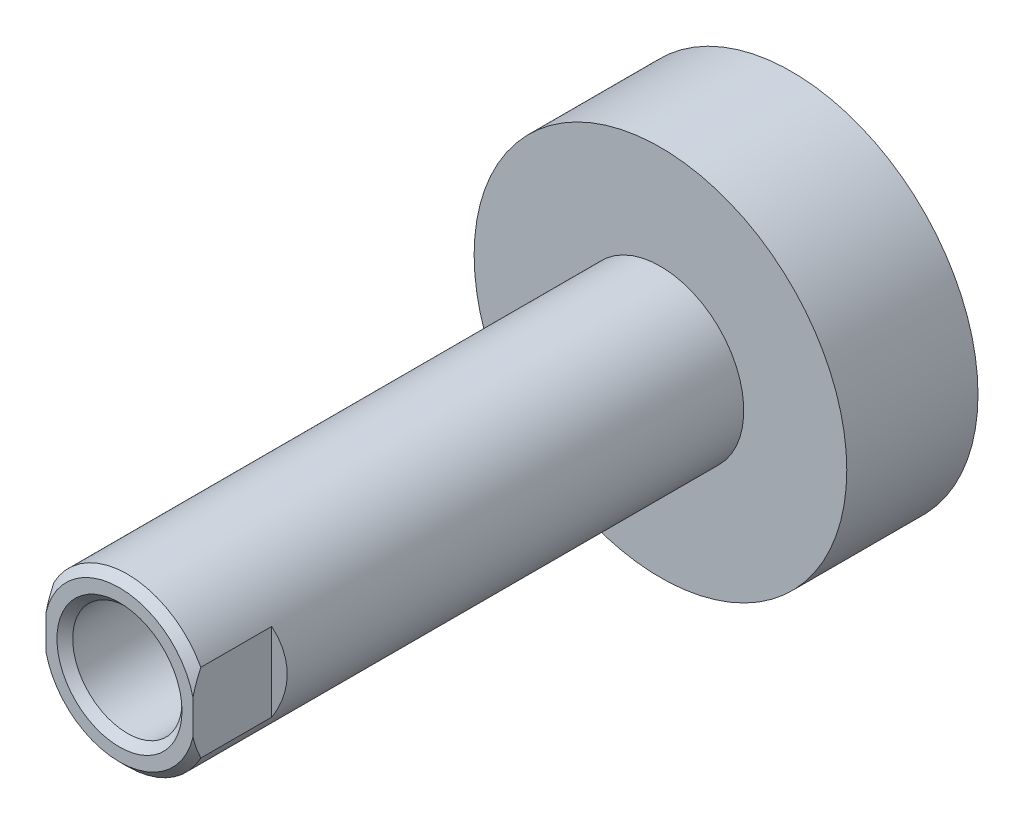
ISO-10303-21;
HEADER;
FILE_DESCRIPTION(('STEP AP214'),'2;1');
FILE_NAME('part.step','',(''),(''),'','','');
FILE_SCHEMA(('AUTOMOTIVE_DESIGN { 1 0 10303 214 1 1 1 1 }'));
ENDSEC;
DATA;
#1=APPLICATION_CONTEXT('core data for automotive mechanical design processes');
#2=APPLICATION_PROTOCOL_DEFINITION('international standard','automotive_design',2000,#1);
#3=PRODUCT_CONTEXT('',#1,'mechanical');
#4=PRODUCT('Part','Part','',(#3));
#5=PRODUCT_RELATED_PRODUCT_CATEGORY('part','',(#4));
#6=PRODUCT_DEFINITION_FORMATION('','',#4);
#7=PRODUCT_DEFINITION_CONTEXT('part definition',#1,'design');
#8=PRODUCT_DEFINITION('design','',#6,#7);
#9=PRODUCT_DEFINITION_SHAPE('','',#8);
#10=(LENGTH_UNIT() NAMED_UNIT(*) SI_UNIT(.MILLI.,.METRE.));
#11=(NAMED_UNIT(*) PLANE_ANGLE_UNIT() SI_UNIT($,.RADIAN.));
#12=(NAMED_UNIT(*) SI_UNIT($,.STERADIAN.) SOLID_ANGLE_UNIT());
#13=UNCERTAINTY_MEASURE_WITH_UNIT(LENGTH_MEASURE(1.E-05),#10,'distance_accuracy_value','');
#14=(GEOMETRIC_REPRESENTATION_CONTEXT(3) GLOBAL_UNCERTAINTY_ASSIGNED_CONTEXT((#13)) GLOBAL_UNIT_ASSIGNED_CONTEXT((#10,
#11,#12)) REPRESENTATION_CONTEXT('',''));
#15=CARTESIAN_POINT('',(0.,0.,0.));
#16=DIRECTION('',(0.,0.,1.));
#17=DIRECTION('',(1.,0.,0.));
#18=AXIS2_PLACEMENT_3D('',#15,#16,#17);
#19=CARTESIAN_POINT('',(0.,0.,11.5365600000246));
#20=DIRECTION('',(0.,0.,1.));
#21=DIRECTION('',(1.,0.,0.));
#22=AXIS2_PLACEMENT_3D('',#19,#20,#21);
#23=CONICAL_SURFACE('',#22,1.72719999989113,1.02974425858718);
#24=CARTESIAN_POINT('',(0.,2.84226460079169E-11,10.4987535388261));
#25=VERTEX_POINT('',#24);
#26=VERTEX_LOOP('',#25);
#27=FACE_BOUND('',#26,.T.);
#28=CARTESIAN_POINT('',(0.,0.,11.53656));
#29=DIRECTION('',(0.,0.,1.));
#30=DIRECTION('',(0.,-1.,0.));
#31=AXIS2_PLACEMENT_3D('',#28,#29,#30);
#32=CIRCLE('',#31,1.7272);
#33=CARTESIAN_POINT('',(0.,-1.7272,11.53656));
#34=VERTEX_POINT('',#33);
#35=EDGE_CURVE('E121',#34,#34,#32,.T.);
#36=ORIENTED_EDGE('',*,*,#35,.T.);
#37=EDGE_LOOP('',(#36));
#38=FACE_BOUND('',#37,.T.);
#39=ADVANCED_FACE('F17',(#27,#38),#23,.F.);
#40=CARTESIAN_POINT('',(0.,0.,25.614));
#41=DIRECTION('',(0.,0.,1.));
#42=DIRECTION('',(0.,-1.,0.));
#43=AXIS2_PLACEMENT_3D('',#40,#41,#42);
#44=CYLINDRICAL_SURFACE('',#43,1.7272);
#45=ORIENTED_EDGE('',*,*,#35,.F.);
#46=EDGE_LOOP('',(#45));
#47=FACE_BOUND('',#46,.T.);
#48=CARTESIAN_POINT('',(0.,0.,13.93));
#49=DIRECTION('',(0.,0.,1.));
#50=DIRECTION('',(0.,-1.,0.));
#51=AXIS2_PLACEMENT_3D('',#48,#49,#50);
#52=CIRCLE('',#51,1.7272);
#53=CARTESIAN_POINT('',(0.,-1.7272,13.93));
#54=VERTEX_POINT('',#53);
#55=EDGE_CURVE('E20',#54,#54,#52,.T.);
#56=ORIENTED_EDGE('',*,*,#55,.T.);
#57=EDGE_LOOP('',(#56));
#58=FACE_BOUND('',#57,.T.);
#59=ADVANCED_FACE('F189',(#47,#58),#44,.F.);
#60=CARTESIAN_POINT('',(1.7272,0.,13.93));
#61=DIRECTION('',(0.,0.,-1.));
#62=DIRECTION('',(0.,1.,0.));
#63=AXIS2_PLACEMENT_3D('',#60,#61,#62);
#64=PLANE('',#63);
#65=CARTESIAN_POINT('',(0.,0.,13.93));
#66=DIRECTION('',(0.,0.,1.));
#67=DIRECTION('',(0.,-1.,0.));
#68=AXIS2_PLACEMENT_3D('',#65,#66,#67);
#69=CIRCLE('',#68,2.0828);
#70=CARTESIAN_POINT('',(0.,-2.0828,13.93));
#71=VERTEX_POINT('',#70);
#72=EDGE_CURVE('E120',#71,#71,#69,.T.);
#73=ORIENTED_EDGE('',*,*,#72,.T.);
#74=EDGE_LOOP('',(#73));
#75=FACE_BOUND('',#74,.T.);
#76=ORIENTED_EDGE('',*,*,#55,.F.);
#77=EDGE_LOOP('',(#76));
#78=FACE_BOUND('',#77,.T.);
#79=ADVANCED_FACE('F186',(#75,#78),#64,.F.);
#80=CARTESIAN_POINT('',(0.,0.,25.614));
#81=DIRECTION('',(0.,0.,1.));
#82=DIRECTION('',(0.,-1.,0.));
#83=AXIS2_PLACEMENT_3D('',#80,#81,#82);
#84=CYLINDRICAL_SURFACE('',#83,2.0828);
#85=CARTESIAN_POINT('',(0.,0.,25.3140000000371));
#86=DIRECTION('',(0.,0.,1.));
#87=DIRECTION('',(0.,-1.,0.));
#88=AXIS2_PLACEMENT_3D('',#85,#86,#87);
#89=CIRCLE('',#88,2.0827999999824);
#90=CARTESIAN_POINT('',(0.,-2.0827999999824,25.3140000000371));
#91=VERTEX_POINT('',#90);
#92=EDGE_CURVE('E117',#91,#91,#89,.T.);
#93=ORIENTED_EDGE('',*,*,#92,.T.);
#94=EDGE_LOOP('',(#93));
#95=FACE_BOUND('',#94,.T.);
#96=ORIENTED_EDGE('',*,*,#72,.F.);
#97=EDGE_LOOP('',(#96));
#98=FACE_BOUND('',#97,.T.);
#99=ADVANCED_FACE('F182',(#95,#98),#84,.F.);
#100=CARTESIAN_POINT('',(0.,0.,0.));
#101=DIRECTION('',(0.,0.,1.));
#102=DIRECTION('',(1.,0.,0.));
#103=AXIS2_PLACEMENT_3D('',#100,#101,#102);
#104=PLANE('',#103);
#105=CARTESIAN_POINT('',(0.,0.,0.));
#106=DIRECTION('',(0.,0.,-1.));
#107=DIRECTION('',(-1.,0.,0.));
#108=AXIS2_PLACEMENT_3D('',#105,#106,#107);
#109=CIRCLE('',#108,7.1);
#110=CARTESIAN_POINT('',(-7.1,0.,0.));
#111=VERTEX_POINT('',#110);
#112=EDGE_CURVE('E82',#111,#111,#109,.F.);
#113=ORIENTED_EDGE('',*,*,#112,.F.);
#114=EDGE_LOOP('',(#113));
#115=FACE_BOUND('',#114,.T.);
#116=ADVANCED_FACE('F178',(#115),#104,.F.);
#117=CARTESIAN_POINT('',(0.,0.,25.6140000000755));
#118=DIRECTION('',(0.,0.,1.));
#119=DIRECTION('',(1.,0.,0.));
#120=AXIS2_PLACEMENT_3D('',#117,#118,#119);
#121=CONICAL_SURFACE('',#120,2.38280000007763,0.785398163492187);
#122=CARTESIAN_POINT('',(0.,0.,25.6139999999618));
#123=DIRECTION('',(0.,0.,1.));
#124=DIRECTION('',(1.,0.,0.));
#125=AXIS2_PLACEMENT_3D('',#122,#123,#124);
#126=CIRCLE('',#125,2.38279999996394);
#127=CARTESIAN_POINT('',(2.38279999996394,0.,25.6139999999618));
#128=VERTEX_POINT('',#127);
#129=EDGE_CURVE('E152',#128,#128,#126,.T.);
#130=ORIENTED_EDGE('',*,*,#129,.T.);
#131=EDGE_LOOP('',(#130));
#132=FACE_BOUND('',#131,.T.);
#133=ORIENTED_EDGE('',*,*,#92,.F.);
#134=EDGE_LOOP('',(#133));
#135=FACE_BOUND('',#134,.T.);
#136=ADVANCED_FACE('F174',(#132,#135),#121,.F.);
#137=CARTESIAN_POINT('',(0.,0.,5.));
#138=DIRECTION('',(0.,0.,-1.));
#139=DIRECTION('',(-1.,0.,0.));
#140=AXIS2_PLACEMENT_3D('',#137,#138,#139);
#141=CYLINDRICAL_SURFACE('',#140,7.1);
#142=ORIENTED_EDGE('',*,*,#112,.T.);
#143=EDGE_LOOP('',(#142));
#144=FACE_BOUND('',#143,.T.);
#145=CARTESIAN_POINT('',(0.,0.,5.));
#146=DIRECTION('',(0.,0.,-1.));
#147=DIRECTION('',(-1.,0.,0.));
#148=AXIS2_PLACEMENT_3D('',#145,#146,#147);
#149=CIRCLE('',#148,7.1);
#150=CARTESIAN_POINT('',(-7.1,0.,5.));
#151=VERTEX_POINT('',#150);
#152=EDGE_CURVE('E149',#151,#151,#149,.F.);
#153=ORIENTED_EDGE('',*,*,#152,.F.);
#154=EDGE_LOOP('',(#153));
#155=FACE_BOUND('',#154,.T.);
#156=ADVANCED_FACE('F169',(#144,#155),#141,.T.);
#157=CARTESIAN_POINT('',(0.,0.,25.3139999999235));
#158=DIRECTION('',(0.,0.,-1.));
#159=DIRECTION('',(0.,1.,0.));
#160=AXIS2_PLACEMENT_3D('',#157,#158,#159);
#161=CONICAL_SURFACE('',#160,3.17499999999882,0.785398163302709);
#162=CARTESIAN_POINT('',(-2.79999999999672,-0.652399417525146,25.6139999999799));
#163=CARTESIAN_POINT('',(-2.79999999999882,-0.725522758866391,25.5974129545509));
#164=CARTESIAN_POINT('',(-2.79999999999968,-0.798035787011699,25.5783055413972));
#165=CARTESIAN_POINT('',(-2.80000000000032,-0.941542467122832,25.535725461008));
#166=CARTESIAN_POINT('',(-2.80000000000009,-1.0125399628547,25.5122658074199));
#167=CARTESIAN_POINT('',(-2.79999999999991,-1.15311390257721,25.4615642521423));
#168=CARTESIAN_POINT('',(-2.79999999999996,-1.22269102456504,25.4343242058067));
#169=CARTESIAN_POINT('',(-2.80000000000005,-1.36069395769507,25.3765145329336));
#170=CARTESIAN_POINT('',(-2.80000000000009,-1.42911576562111,25.3459353184433));
#171=CARTESIAN_POINT('',(-2.8,-1.49687173796956,25.313999999933));
#172=B_SPLINE_CURVE_WITH_KNOTS('',3,(#162,#163,#164,#165,#166,#167,#168,#169,#170,#171),
.UNSPECIFIED.,.F.,.F.,(4,2,2,2,4),(0.,0.224844580121859,0.449027381863307,0.673100544963369,
0.897834918181198),.UNSPECIFIED.);
#173=CARTESIAN_POINT('',(-2.8,-0.652399417443052,25.614));
#174=VERTEX_POINT('',#173);
#175=CARTESIAN_POINT('',(-2.8,-1.49687173798092,25.3139999999665));
#176=VERTEX_POINT('',#175);
#177=EDGE_CURVE('E81',#174,#176,#172,.T.);
#178=ORIENTED_EDGE('',*,*,#177,.T.);
#179=CARTESIAN_POINT('',(0.,0.,25.314));
#180=DIRECTION('',(0.,0.,-1.));
#181=DIRECTION('',(-1.,0.,0.));
#182=AXIS2_PLACEMENT_3D('',#179,#180,#181);
#183=CIRCLE('',#182,3.175);
#184=CARTESIAN_POINT('',(2.8,-1.49687173798091,25.3139999999665));
#185=VERTEX_POINT('',#184);
#186=EDGE_CURVE('E85',#185,#176,#183,.T.);
#187=ORIENTED_EDGE('',*,*,#186,.F.);
#188=CARTESIAN_POINT('',(2.8,-1.49687173796955,25.313999999933));
#189=CARTESIAN_POINT('',(2.8,-1.42911576562111,25.3459353184433));
#190=CARTESIAN_POINT('',(2.8,-1.36069395769508,25.3765145329335));
#191=CARTESIAN_POINT('',(2.8,-1.22269102456509,25.4343242058067));
#192=CARTESIAN_POINT('',(2.8,-1.15311390257727,25.4615642521423));
#193=CARTESIAN_POINT('',(2.8,-1.01253996285478,25.5122658074199));
#194=CARTESIAN_POINT('',(2.8,-0.941542467122903,25.5357254610079));
#195=CARTESIAN_POINT('',(2.8,-0.798035787011902,25.5783055413972));
#196=CARTESIAN_POINT('',(2.8,-0.725522758866727,25.5974129545514));
#197=CARTESIAN_POINT('',(2.8,-0.652399417525751,25.6139999999812));
#198=B_SPLINE_CURVE_WITH_KNOTS('',3,(#188,#189,#190,#191,#192,#193,#194,#195,#196,#197),
.UNSPECIFIED.,.F.,.F.,(4,2,2,2,4),(0.,0.224734373217776,0.448807536317823,0.672990338059194,
0.897834918180934),.UNSPECIFIED.);
#199=CARTESIAN_POINT('',(2.8,-0.652399417443043,25.614));
#200=VERTEX_POINT('',#199);
#201=EDGE_CURVE('E71',#185,#200,#198,.T.);
#202=ORIENTED_EDGE('',*,*,#201,.T.);
#203=CARTESIAN_POINT('',(0.,0.,25.6140000000187));
#204=DIRECTION('',(0.,0.,-1.));
#205=DIRECTION('',(0.,1.,0.));
#206=AXIS2_PLACEMENT_3D('',#203,#204,#205);
#207=CIRCLE('',#206,2.87499999996044);
#208=EDGE_CURVE('E116',#200,#174,#207,.T.);
#209=ORIENTED_EDGE('',*,*,#208,.T.);
#210=EDGE_LOOP('',(#178,#187,#202,#209));
#211=FACE_BOUND('',#210,.T.);
#212=ADVANCED_FACE('F86',(#211),#161,.T.);
#213=CARTESIAN_POINT('',(-2.8,-7.1,22.614));
#214=DIRECTION('',(0.500000000000004,0.,-0.866025403784436));
#215=DIRECTION('',(-0.866025403784436,0.,-0.500000000000004));
#216=AXIS2_PLACEMENT_3D('',#213,#214,#215);
#217=PLANE('',#216);
#218=CARTESIAN_POINT('',(0.,0.,24.230580753731));
#219=DIRECTION('',(0.500000000000004,0.,-0.866025403784436));
#220=DIRECTION('',(-0.866025403784436,0.,-0.500000000000004));
#221=AXIS2_PLACEMENT_3D('',#218,#219,#220);
#222=ELLIPSE('',#221,3.66617420935413,3.175);
#223=CARTESIAN_POINT('',(-2.8,-1.49687173799227,22.614));
#224=VERTEX_POINT('',#223);
#225=CARTESIAN_POINT('',(-2.8,1.49687173799227,22.614));
#226=VERTEX_POINT('',#225);
#227=EDGE_CURVE('E90',#224,#226,#222,.T.);
#228=ORIENTED_EDGE('',*,*,#227,.F.);
#229=DIRECTION('',(0.,1.,0.));
#230=VECTOR('',#229,1.);
#231=CARTESIAN_POINT('',(-2.8,-7.1,22.614));
#232=LINE('',#231,#230);
#233=EDGE_CURVE('E112',#224,#226,#232,.T.);
#234=ORIENTED_EDGE('',*,*,#233,.T.);
#235=EDGE_LOOP('',(#228,#234));
#236=FACE_BOUND('',#235,.T.);
#237=ADVANCED_FACE('F168',(#236),#217,.F.);
#238=CARTESIAN_POINT('',(0.,0.,25.614));
#239=DIRECTION('',(0.,0.,-1.));
#240=DIRECTION('',(0.,1.,0.));
#241=AXIS2_PLACEMENT_3D('',#238,#239,#240);
#242=PLANE('',#241);
#243=ORIENTED_EDGE('',*,*,#129,.F.);
#244=EDGE_LOOP('',(#243));
#245=FACE_BOUND('',#244,.T.);
#246=DIRECTION('',(0.,1.,0.));
#247=VECTOR('',#246,1.);
#248=CARTESIAN_POINT('',(2.8,0.,25.614));
#249=LINE('',#248,#247);
#250=CARTESIAN_POINT('',(2.8,0.652399417401792,25.6140000000093));
#251=VERTEX_POINT('',#250);
#252=EDGE_CURVE('E77',#251,#200,#249,.F.);
#253=ORIENTED_EDGE('',*,*,#252,.F.);
#254=CARTESIAN_POINT('',(0.,0.,25.6140000000187));
#255=DIRECTION('',(0.,0.,-1.));
#256=DIRECTION('',(0.,1.,0.));
#257=AXIS2_PLACEMENT_3D('',#254,#255,#256);
#258=CIRCLE('',#257,2.87499999996044);
#259=CARTESIAN_POINT('',(-2.8,0.652399417401802,25.6140000000093));
#260=VERTEX_POINT('',#259);
#261=EDGE_CURVE('E100',#260,#251,#258,.T.);
#262=ORIENTED_EDGE('',*,*,#261,.F.);
#263=DIRECTION('',(0.,1.,0.));
#264=VECTOR('',#263,1.);
#265=CARTESIAN_POINT('',(-2.8,-7.1,25.614));
#266=LINE('',#265,#264);
#267=EDGE_CURVE('E109',#260,#174,#266,.F.);
#268=ORIENTED_EDGE('',*,*,#267,.T.);
#269=ORIENTED_EDGE('',*,*,#208,.F.);
#270=EDGE_LOOP('',(#253,#262,#268,#269));
#271=FACE_BOUND('',#270,.T.);
#272=ADVANCED_FACE('F216',(#245,#271),#242,.F.);
#273=CARTESIAN_POINT('',(2.8,-7.1,22.614));
#274=DIRECTION('',(-0.500000000000004,0.,-0.866025403784436));
#275=DIRECTION('',(-0.866025403784436,0.,0.500000000000004));
#276=AXIS2_PLACEMENT_3D('',#273,#274,#275);
#277=PLANE('',#276);
#278=CARTESIAN_POINT('',(0.,0.,24.230580753731));
#279=DIRECTION('',(-0.500000000000004,0.,-0.866025403784436));
#280=DIRECTION('',(0.866025403784436,0.,-0.500000000000004));
#281=AXIS2_PLACEMENT_3D('',#278,#279,#280);
#282=ELLIPSE('',#281,3.66617420935413,3.175);
#283=CARTESIAN_POINT('',(2.8,1.49687173799227,22.614));
#284=VERTEX_POINT('',#283);
#285=CARTESIAN_POINT('',(2.8,-1.49687173799227,22.614));
#286=VERTEX_POINT('',#285);
#287=EDGE_CURVE('E91',#284,#286,#282,.T.);
#288=ORIENTED_EDGE('',*,*,#287,.F.);
#289=DIRECTION('',(0.,1.,0.));
#290=VECTOR('',#289,1.);
#291=CARTESIAN_POINT('',(2.8,-7.1,22.614));
#292=LINE('',#291,#290);
#293=EDGE_CURVE('E96',#284,#286,#292,.F.);
#294=ORIENTED_EDGE('',*,*,#293,.T.);
#295=EDGE_LOOP('',(#288,#294));
#296=FACE_BOUND('',#295,.T.);
#297=ADVANCED_FACE('F209',(#296),#277,.F.);
#298=CARTESIAN_POINT('',(0.,0.,5.));
#299=DIRECTION('',(0.,0.,1.));
#300=DIRECTION('',(1.,0.,0.));
#301=AXIS2_PLACEMENT_3D('',#298,#299,#300);
#302=PLANE('',#301);
#303=ORIENTED_EDGE('',*,*,#152,.T.);
#304=EDGE_LOOP('',(#303));
#305=FACE_BOUND('',#304,.T.);
#306=CARTESIAN_POINT('',(0.,0.,5.));
#307=DIRECTION('',(0.,0.,-1.));
#308=DIRECTION('',(-1.,0.,0.));
#309=AXIS2_PLACEMENT_3D('',#306,#307,#308);
#310=CIRCLE('',#309,3.175);
#311=CARTESIAN_POINT('',(-3.175,0.,5.));
#312=VERTEX_POINT('',#311);
#313=EDGE_CURVE('E98',#312,#312,#310,.F.);
#314=ORIENTED_EDGE('',*,*,#313,.F.);
#315=EDGE_LOOP('',(#314));
#316=FACE_BOUND('',#315,.T.);
#317=ADVANCED_FACE('F207',(#305,#316),#302,.T.);
#318=CARTESIAN_POINT('',(-2.8,-7.1,25.614));
#319=DIRECTION('',(1.,0.,0.));
#320=DIRECTION('',(0.,0.,-1.));
#321=AXIS2_PLACEMENT_3D('',#318,#319,#320);
#322=PLANE('',#321);
#323=ORIENTED_EDGE('',*,*,#177,.F.);
#324=ORIENTED_EDGE('',*,*,#267,.F.);
#325=CARTESIAN_POINT('',(-2.8,1.49687173796956,25.313999999933));
#326=CARTESIAN_POINT('',(-2.8,1.42911576562112,25.3459353184433));
#327=CARTESIAN_POINT('',(-2.8,1.36069395769509,25.3765145329335));
#328=CARTESIAN_POINT('',(-2.8,1.22269102456509,25.4343242058067));
#329=CARTESIAN_POINT('',(-2.8,1.15311390257727,25.4615642521423));
#330=CARTESIAN_POINT('',(-2.8,1.01253996285478,25.5122658074199));
#331=CARTESIAN_POINT('',(-2.8,0.94154246712291,25.5357254610079));
#332=CARTESIAN_POINT('',(-2.8,0.79803578701191,25.5783055413972));
#333=CARTESIAN_POINT('',(-2.8,0.725522758866736,25.5974129545514));
#334=CARTESIAN_POINT('',(-2.8,0.65239941752576,25.6139999999812));
#335=B_SPLINE_CURVE_WITH_KNOTS('',3,(#325,#326,#327,#328,#329,#330,#331,#332,#333,#334),
.UNSPECIFIED.,.F.,.F.,(4,2,2,2,4),(0.,0.224734373217775,0.448807536317821,0.672990338059194,
0.897834918180932),.UNSPECIFIED.);
#336=CARTESIAN_POINT('',(-2.8,1.49687173798091,25.3139999999665));
#337=VERTEX_POINT('',#336);
#338=EDGE_CURVE('E108',#337,#260,#335,.T.);
#339=ORIENTED_EDGE('',*,*,#338,.F.);
#340=DIRECTION('',(0.,0.,-1.));
#341=VECTOR('',#340,1.);
#342=CARTESIAN_POINT('',(-2.8,1.49687173799227,34.5942561210692));
#343=LINE('',#342,#341);
#344=EDGE_CURVE('E104',#226,#337,#343,.F.);
#345=ORIENTED_EDGE('',*,*,#344,.F.);
#346=ORIENTED_EDGE('',*,*,#233,.F.);
#347=DIRECTION('',(0.,0.,-1.));
#348=VECTOR('',#347,1.);
#349=CARTESIAN_POINT('',(-2.8,-1.49687173799227,25.614));
#350=LINE('',#349,#348);
#351=EDGE_CURVE('E106',#176,#224,#350,.T.);
#352=ORIENTED_EDGE('',*,*,#351,.F.);
#353=EDGE_LOOP('',(#323,#324,#339,#345,#346,#352));
#354=FACE_BOUND('',#353,.T.);
#355=ADVANCED_FACE('F138',(#354),#322,.F.);
#356=CARTESIAN_POINT('',(0.,0.,25.3139999999235));
#357=DIRECTION('',(0.,0.,-1.));
#358=DIRECTION('',(0.,1.,0.));
#359=AXIS2_PLACEMENT_3D('',#356,#357,#358);
#360=CONICAL_SURFACE('',#359,3.17499999999882,0.785398163302709);
#361=ORIENTED_EDGE('',*,*,#338,.T.);
#362=ORIENTED_EDGE('',*,*,#261,.T.);
#363=CARTESIAN_POINT('',(2.79999999999956,0.652399417527919,25.6139999999805));
#364=CARTESIAN_POINT('',(2.79999999999984,0.725522758868216,25.5974129545509));
#365=CARTESIAN_POINT('',(2.79999999999996,0.798035787012704,25.578305541397));
#366=CARTESIAN_POINT('',(2.80000000000005,0.941542467122344,25.535725461008));
#367=CARTESIAN_POINT('',(2.80000000000002,1.01253996285354,25.5122658074203));
#368=CARTESIAN_POINT('',(2.79999999999999,1.15311390257472,25.4615642521433));
#369=CARTESIAN_POINT('',(2.8,1.22269102456189,25.434324205808));
#370=CARTESIAN_POINT('',(2.80000000000001,1.36069395769062,25.3765145329355));
#371=CARTESIAN_POINT('',(2.80000000000002,1.42911576561603,25.3459353184456));
#372=CARTESIAN_POINT('',(2.8,1.49687173796386,25.3139999999357));
#373=B_SPLINE_CURVE_WITH_KNOTS('',3,(#363,#364,#365,#366,#367,#368,#369,#370,#371,#372),
.UNSPECIFIED.,.F.,.F.,(4,2,2,2,4),(0.,0.224844580119593,0.449027381858833,0.673100544956742,
0.897834918172369),.UNSPECIFIED.);
#374=CARTESIAN_POINT('',(2.8,1.49687173797728,25.3139999999682));
#375=VERTEX_POINT('',#374);
#376=EDGE_CURVE('E35',#251,#375,#373,.T.);
#377=ORIENTED_EDGE('',*,*,#376,.T.);
#378=CARTESIAN_POINT('',(0.,0.,25.314));
#379=DIRECTION('',(0.,0.,-1.));
#380=DIRECTION('',(-1.,0.,0.));
#381=AXIS2_PLACEMENT_3D('',#378,#379,#380);
#382=CIRCLE('',#381,3.175);
#383=EDGE_CURVE('E26',#337,#375,#382,.T.);
#384=ORIENTED_EDGE('',*,*,#383,.F.);
#385=EDGE_LOOP('',(#361,#362,#377,#384));
#386=FACE_BOUND('',#385,.T.);
#387=ADVANCED_FACE('F134',(#386),#360,.T.);
#388=CARTESIAN_POINT('',(2.8,-7.1,25.614));
#389=DIRECTION('',(-1.,0.,0.));
#390=DIRECTION('',(0.,0.,1.));
#391=AXIS2_PLACEMENT_3D('',#388,#389,#390);
#392=PLANE('',#391);
#393=ORIENTED_EDGE('',*,*,#376,.F.);
#394=ORIENTED_EDGE('',*,*,#252,.T.);
#395=ORIENTED_EDGE('',*,*,#201,.F.);
#396=DIRECTION('',(0.,0.,1.));
#397=VECTOR('',#396,1.);
#398=CARTESIAN_POINT('',(2.8,-1.49687173799226,25.614));
#399=LINE('',#398,#397);
#400=EDGE_CURVE('E76',#286,#185,#399,.T.);
#401=ORIENTED_EDGE('',*,*,#400,.F.);
#402=ORIENTED_EDGE('',*,*,#293,.F.);
#403=DIRECTION('',(0.,0.,-1.));
#404=VECTOR('',#403,1.);
#405=CARTESIAN_POINT('',(2.8,1.49687173799227,34.5942561210692));
#406=LINE('',#405,#404);
#407=EDGE_CURVE('E11',#375,#284,#406,.T.);
#408=ORIENTED_EDGE('',*,*,#407,.F.);
#409=EDGE_LOOP('',(#393,#394,#395,#401,#402,#408));
#410=FACE_BOUND('',#409,.T.);
#411=ADVANCED_FACE('F73',(#410),#392,.F.);
#412=CARTESIAN_POINT('',(0.,0.,34.5942561210692));
#413=DIRECTION('',(0.,0.,-1.));
#414=DIRECTION('',(-1.,0.,0.));
#415=AXIS2_PLACEMENT_3D('',#412,#413,#414);
#416=CYLINDRICAL_SURFACE('',#415,3.175);
#417=ORIENTED_EDGE('',*,*,#313,.T.);
#418=EDGE_LOOP('',(#417));
#419=FACE_BOUND('',#418,.T.);
#420=ORIENTED_EDGE('',*,*,#383,.T.);
#421=ORIENTED_EDGE('',*,*,#407,.T.);
#422=ORIENTED_EDGE('',*,*,#287,.T.);
#423=ORIENTED_EDGE('',*,*,#400,.T.);
#424=ORIENTED_EDGE('',*,*,#186,.T.);
#425=ORIENTED_EDGE('',*,*,#351,.T.);
#426=ORIENTED_EDGE('',*,*,#227,.T.);
#427=ORIENTED_EDGE('',*,*,#344,.T.);
#428=EDGE_LOOP('',(#420,#421,#422,#423,#424,#425,#426,#427));
#429=FACE_BOUND('',#428,.T.);
#430=ADVANCED_FACE('F95',(#419,#429),#416,.T.);
#431=CLOSED_SHELL('',(#39,#59,#79,#99,#116,#136,#156,#212,#237,#272,#297,#317,#355,#387,#411,#430));
#432=MANIFOLD_SOLID_BREP('B1',#431);
#433=ADVANCED_BREP_SHAPE_REPRESENTATION('',(#18,#432),#14);
#434=SHAPE_DEFINITION_REPRESENTATION(#9,#433);
ENDSEC;
END-ISO-10303-21;
